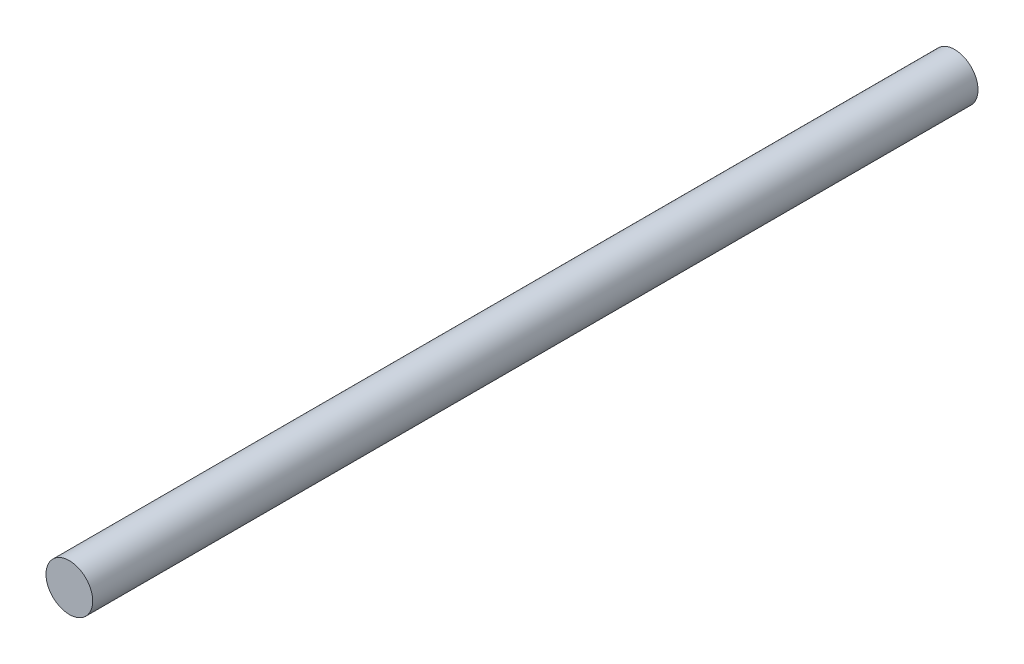
ISO-10303-21;
HEADER;
FILE_DESCRIPTION(('STEP AP214'),'2;1');
FILE_NAME('part.step','',(''),(''),'','','');
FILE_SCHEMA(('AUTOMOTIVE_DESIGN { 1 0 10303 214 1 1 1 1 }'));
ENDSEC;
DATA;
#1=APPLICATION_CONTEXT('core data for automotive mechanical design processes');
#2=APPLICATION_PROTOCOL_DEFINITION('international standard','automotive_design',2000,#1);
#3=PRODUCT_CONTEXT('',#1,'mechanical');
#4=PRODUCT('Part','Part','',(#3));
#5=PRODUCT_RELATED_PRODUCT_CATEGORY('part','',(#4));
#6=PRODUCT_DEFINITION_FORMATION('','',#4);
#7=PRODUCT_DEFINITION_CONTEXT('part definition',#1,'design');
#8=PRODUCT_DEFINITION('design','',#6,#7);
#9=PRODUCT_DEFINITION_SHAPE('','',#8);
#10=(LENGTH_UNIT() NAMED_UNIT(*) SI_UNIT(.MILLI.,.METRE.));
#11=(NAMED_UNIT(*) PLANE_ANGLE_UNIT() SI_UNIT($,.RADIAN.));
#12=(NAMED_UNIT(*) SI_UNIT($,.STERADIAN.) SOLID_ANGLE_UNIT());
#13=UNCERTAINTY_MEASURE_WITH_UNIT(LENGTH_MEASURE(1.E-05),#10,'distance_accuracy_value','');
#14=(GEOMETRIC_REPRESENTATION_CONTEXT(3) GLOBAL_UNCERTAINTY_ASSIGNED_CONTEXT((#13)) GLOBAL_UNIT_ASSIGNED_CONTEXT((#10,
#11,#12)) REPRESENTATION_CONTEXT('',''));
#15=CARTESIAN_POINT('',(0.,0.,0.));
#16=DIRECTION('',(0.,0.,1.));
#17=DIRECTION('',(1.,0.,0.));
#18=AXIS2_PLACEMENT_3D('',#15,#16,#17);
#19=CARTESIAN_POINT('',(0.,0.,304.8));
#20=DIRECTION('',(0.,0.,-1.));
#21=DIRECTION('',(-1.,0.,0.));
#22=AXIS2_PLACEMENT_3D('',#19,#20,#21);
#23=CYLINDRICAL_SURFACE('',#22,2.5);
#24=CARTESIAN_POINT('',(0.,0.,0.));
#25=DIRECTION('',(0.,0.,1.));
#26=DIRECTION('',(1.,0.,0.));
#27=AXIS2_PLACEMENT_3D('',#24,#25,#26);
#28=CIRCLE('',#27,2.5);
#29=CARTESIAN_POINT('',(-2.5,0.,0.));
#30=VERTEX_POINT('',#29);
#31=EDGE_CURVE('E10',#30,#30,#28,.T.);
#32=CARTESIAN_POINT('',(0.,0.,94.8));
#33=DIRECTION('',(0.,0.,1.));
#34=DIRECTION('',(1.,0.,0.));
#35=AXIS2_PLACEMENT_3D('',#32,#33,#34);
#36=CIRCLE('',#35,2.5);
#37=CARTESIAN_POINT('',(-2.5,0.,94.8));
#38=VERTEX_POINT('',#37);
#39=EDGE_CURVE('E44',#38,#38,#36,.T.);
#40=CARTESIAN_POINT('',(-2.5,0.,0.));
#41=CARTESIAN_POINT('',(-2.5,0.,0.987499999999992));
#42=CARTESIAN_POINT('',(-2.5,0.,1.97499999999999));
#43=CARTESIAN_POINT('',(-2.5,0.,3.94999999999999));
#44=CARTESIAN_POINT('',(-2.5,0.,4.9375));
#45=CARTESIAN_POINT('',(-2.5,0.,6.91250000000001));
#46=CARTESIAN_POINT('',(-2.5,0.,7.9));
#47=CARTESIAN_POINT('',(-2.5,0.,9.875));
#48=CARTESIAN_POINT('',(-2.5,0.,10.8625));
#49=CARTESIAN_POINT('',(-2.5,0.,12.8375));
#50=CARTESIAN_POINT('',(-2.5,0.,13.825));
#51=CARTESIAN_POINT('',(-2.5,0.,15.8));
#52=CARTESIAN_POINT('',(-2.5,0.,16.7875));
#53=CARTESIAN_POINT('',(-2.5,0.,18.7625));
#54=CARTESIAN_POINT('',(-2.5,0.,19.75));
#55=CARTESIAN_POINT('',(-2.5,0.,21.725));
#56=CARTESIAN_POINT('',(-2.5,0.,22.7125));
#57=CARTESIAN_POINT('',(-2.5,0.,24.6875));
#58=CARTESIAN_POINT('',(-2.5,0.,25.675));
#59=CARTESIAN_POINT('',(-2.5,0.,27.65));
#60=CARTESIAN_POINT('',(-2.5,0.,28.6375));
#61=CARTESIAN_POINT('',(-2.5,0.,30.6125));
#62=CARTESIAN_POINT('',(-2.5,0.,31.6));
#63=CARTESIAN_POINT('',(-2.5,0.,33.575));
#64=CARTESIAN_POINT('',(-2.5,0.,34.5625));
#65=CARTESIAN_POINT('',(-2.5,0.,36.5375));
#66=CARTESIAN_POINT('',(-2.5,0.,37.525));
#67=CARTESIAN_POINT('',(-2.5,0.,39.5));
#68=CARTESIAN_POINT('',(-2.5,0.,40.4875));
#69=CARTESIAN_POINT('',(-2.5,0.,42.4625));
#70=CARTESIAN_POINT('',(-2.5,0.,43.45));
#71=CARTESIAN_POINT('',(-2.5,0.,45.425));
#72=CARTESIAN_POINT('',(-2.5,0.,46.4125));
#73=CARTESIAN_POINT('',(-2.5,0.,48.3875));
#74=CARTESIAN_POINT('',(-2.5,0.,49.375));
#75=CARTESIAN_POINT('',(-2.5,0.,51.35));
#76=CARTESIAN_POINT('',(-2.5,0.,52.3375));
#77=CARTESIAN_POINT('',(-2.5,0.,54.3125));
#78=CARTESIAN_POINT('',(-2.5,0.,55.3));
#79=CARTESIAN_POINT('',(-2.5,0.,57.275));
#80=CARTESIAN_POINT('',(-2.5,0.,58.2625));
#81=CARTESIAN_POINT('',(-2.5,0.,60.2375));
#82=CARTESIAN_POINT('',(-2.5,0.,61.225));
#83=CARTESIAN_POINT('',(-2.5,0.,63.2));
#84=CARTESIAN_POINT('',(-2.5,0.,64.1875));
#85=CARTESIAN_POINT('',(-2.5,0.,66.1625));
#86=CARTESIAN_POINT('',(-2.5,0.,67.15));
#87=CARTESIAN_POINT('',(-2.5,0.,69.125));
#88=CARTESIAN_POINT('',(-2.5,0.,70.1125));
#89=CARTESIAN_POINT('',(-2.5,0.,72.0875));
#90=CARTESIAN_POINT('',(-2.5,0.,73.075));
#91=CARTESIAN_POINT('',(-2.5,0.,75.05));
#92=CARTESIAN_POINT('',(-2.5,0.,76.0375));
#93=CARTESIAN_POINT('',(-2.5,0.,78.0125));
#94=CARTESIAN_POINT('',(-2.5,0.,79.));
#95=CARTESIAN_POINT('',(-2.5,0.,80.975));
#96=CARTESIAN_POINT('',(-2.5,0.,81.9625));
#97=CARTESIAN_POINT('',(-2.5,0.,83.9375));
#98=CARTESIAN_POINT('',(-2.5,0.,84.925));
#99=CARTESIAN_POINT('',(-2.5,0.,86.9));
#100=CARTESIAN_POINT('',(-2.5,0.,87.8875));
#101=CARTESIAN_POINT('',(-2.5,0.,89.8625));
#102=CARTESIAN_POINT('',(-2.5,0.,90.85));
#103=CARTESIAN_POINT('',(-2.5,0.,92.825));
#104=CARTESIAN_POINT('',(-2.5,0.,93.8125));
#105=CARTESIAN_POINT('',(-2.5,0.,94.8));
#106=B_SPLINE_CURVE_WITH_KNOTS('',3,(#40,#41,#42,#43,#44,#45,#46,#47,#48,#49,#50,#51,#52,#53,
#54,#55,#56,#57,#58,#59,#60,#61,#62,#63,#64,#65,#66,#67,#68,#69,#70,#71,#72,#73,#74,#75,#76,#77,
#78,#79,#80,#81,#82,#83,#84,#85,#86,#87,#88,#89,#90,#91,#92,#93,#94,#95,#96,#97,#98,#99,#100,
#101,#102,#103,#104,#105),.UNSPECIFIED.,.F.,.F.,(4,2,2,2,2,2,2,2,2,2,2,2,2,2,2,2,2,2,2,2,2,2,2,
2,2,2,2,2,2,2,2,2,4),(0.,2.96249999999998,5.92500000000001,8.88749999999999,11.85,14.8125,
17.775,20.7375,23.7,26.6625,29.625,32.5875,35.55,38.5125,41.475,44.4375,47.4,50.3625,53.325,
56.2875,59.25,62.2125,65.175,68.1375,71.1,74.0625,77.025,79.9875,82.95,85.9125,88.875,91.8375,
94.8),.UNSPECIFIED.);
#107=EDGE_CURVE('BSEAM37',#30,#38,#106,.T.);
#108=ORIENTED_EDGE('',*,*,#31,.T.);
#109=ORIENTED_EDGE('',*,*,#39,.F.);
#110=ORIENTED_EDGE('',*,*,#107,.T.);
#111=ORIENTED_EDGE('',*,*,#107,.F.);
#112=EDGE_LOOP('',(#108,#110,#109,#111));
#113=FACE_BOUND('',#112,.T.);
#114=ADVANCED_FACE('F37',(#113),#23,.T.);
#115=CARTESIAN_POINT('',(0.,0.,0.));
#116=DIRECTION('',(0.,0.,1.));
#117=DIRECTION('',(1.,0.,0.));
#118=AXIS2_PLACEMENT_3D('',#115,#116,#117);
#119=PLANE('',#118);
#120=ORIENTED_EDGE('',*,*,#31,.F.);
#121=EDGE_LOOP('',(#120));
#122=FACE_BOUND('',#121,.T.);
#123=ADVANCED_FACE('F54',(#122),#119,.F.);
#124=CARTESIAN_POINT('',(0.,0.,94.8));
#125=DIRECTION('',(0.,0.,1.));
#126=DIRECTION('',(1.,0.,0.));
#127=AXIS2_PLACEMENT_3D('',#124,#125,#126);
#128=PLANE('',#127);
#129=ORIENTED_EDGE('',*,*,#39,.T.);
#130=EDGE_LOOP('',(#129));
#131=FACE_BOUND('',#130,.T.);
#132=ADVANCED_FACE('F51',(#131),#128,.T.);
#133=CLOSED_SHELL('',(#114,#123,#132));
#134=MANIFOLD_SOLID_BREP('B2',#133);
#135=ADVANCED_BREP_SHAPE_REPRESENTATION('',(#18,#134),#14);
#136=SHAPE_DEFINITION_REPRESENTATION(#9,#135);
ENDSEC;
END-ISO-10303-21;
